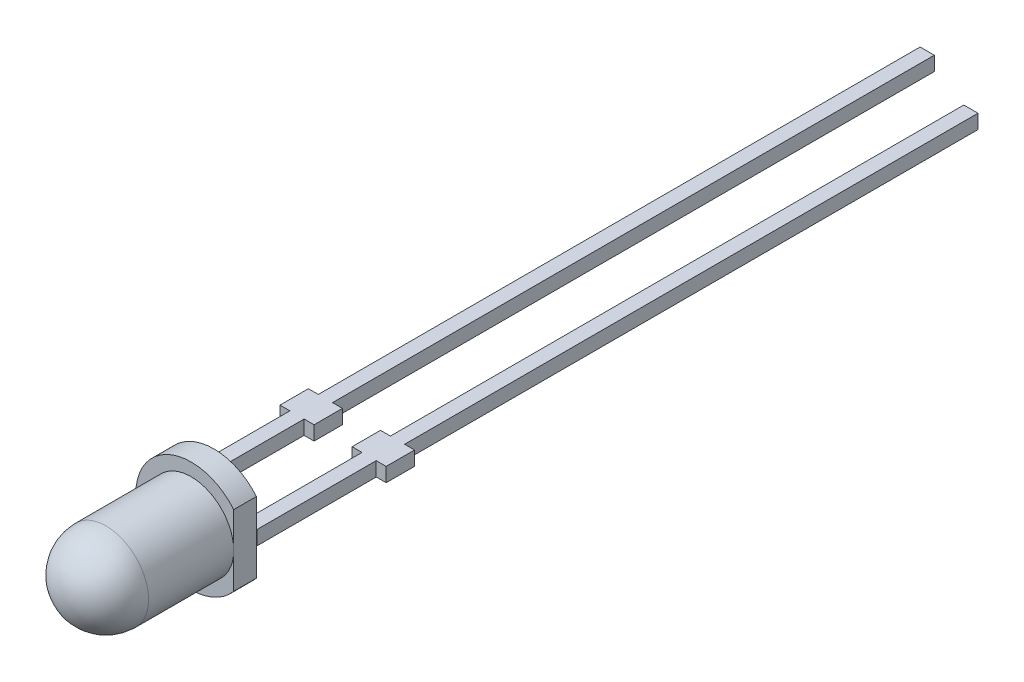
ISO-10303-21;
HEADER;
FILE_DESCRIPTION(('STEP AP214'),'2;1');
FILE_NAME('part.step','',(''),(''),'','','');
FILE_SCHEMA(('AUTOMOTIVE_DESIGN { 1 0 10303 214 1 1 1 1 }'));
ENDSEC;
DATA;
#1=APPLICATION_CONTEXT('core data for automotive mechanical design processes');
#2=APPLICATION_PROTOCOL_DEFINITION('international standard','automotive_design',2000,#1);
#3=PRODUCT_CONTEXT('',#1,'mechanical');
#4=PRODUCT('Part','Part','',(#3));
#5=PRODUCT_RELATED_PRODUCT_CATEGORY('part','',(#4));
#6=PRODUCT_DEFINITION_FORMATION('','',#4);
#7=PRODUCT_DEFINITION_CONTEXT('part definition',#1,'design');
#8=PRODUCT_DEFINITION('design','',#6,#7);
#9=PRODUCT_DEFINITION_SHAPE('','',#8);
#10=(LENGTH_UNIT() NAMED_UNIT(*) SI_UNIT(.MILLI.,.METRE.));
#11=(NAMED_UNIT(*) PLANE_ANGLE_UNIT() SI_UNIT($,.RADIAN.));
#12=(NAMED_UNIT(*) SI_UNIT($,.STERADIAN.) SOLID_ANGLE_UNIT());
#13=UNCERTAINTY_MEASURE_WITH_UNIT(LENGTH_MEASURE(1.E-05),#10,'distance_accuracy_value','');
#14=(GEOMETRIC_REPRESENTATION_CONTEXT(3) GLOBAL_UNCERTAINTY_ASSIGNED_CONTEXT((#13)) GLOBAL_UNIT_ASSIGNED_CONTEXT((#10,
#11,#12)) REPRESENTATION_CONTEXT('',''));
#15=CARTESIAN_POINT('',(0.,0.,0.));
#16=DIRECTION('',(0.,0.,1.));
#17=DIRECTION('',(1.,0.,0.));
#18=AXIS2_PLACEMENT_3D('',#15,#16,#17);
#19=CARTESIAN_POINT('',(-1.52,0.25,-26.4));
#20=DIRECTION('',(-1.,0.,0.));
#21=DIRECTION('',(0.,0.,1.));
#22=AXIS2_PLACEMENT_3D('',#19,#20,#21);
#23=PLANE('',#22);
#24=DIRECTION('',(0.,0.,1.));
#25=VECTOR('',#24,1.);
#26=CARTESIAN_POINT('',(-1.52,-0.25,-26.4));
#27=LINE('',#26,#25);
#28=CARTESIAN_POINT('',(-1.52,-0.25,-26.4));
#29=VERTEX_POINT('',#28);
#30=CARTESIAN_POINT('',(-1.52,-0.25,-5.2));
#31=VERTEX_POINT('',#30);
#32=EDGE_CURVE('E11',#29,#31,#27,.T.);
#33=ORIENTED_EDGE('',*,*,#32,.T.);
#34=DIRECTION('',(0.,1.,0.));
#35=VECTOR('',#34,1.);
#36=CARTESIAN_POINT('',(-1.52,0.25,-5.2));
#37=LINE('',#36,#35);
#38=CARTESIAN_POINT('',(-1.52,0.25,-5.2));
#39=VERTEX_POINT('',#38);
#40=EDGE_CURVE('E24',#31,#39,#37,.T.);
#41=ORIENTED_EDGE('',*,*,#40,.T.);
#42=DIRECTION('',(0.,0.,1.));
#43=VECTOR('',#42,1.);
#44=CARTESIAN_POINT('',(-1.52,0.25,-26.4));
#45=LINE('',#44,#43);
#46=CARTESIAN_POINT('',(-1.52,0.25,-26.4));
#47=VERTEX_POINT('',#46);
#48=EDGE_CURVE('E412',#47,#39,#45,.T.);
#49=ORIENTED_EDGE('',*,*,#48,.F.);
#50=DIRECTION('',(0.,-1.,0.));
#51=VECTOR('',#50,1.);
#52=CARTESIAN_POINT('',(-1.52,0.25,-26.4));
#53=LINE('',#52,#51);
#54=EDGE_CURVE('E410',#47,#29,#53,.T.);
#55=ORIENTED_EDGE('',*,*,#54,.T.);
#56=EDGE_LOOP('',(#33,#41,#49,#55));
#57=FACE_BOUND('',#56,.T.);
#58=ADVANCED_FACE('F17',(#57),#23,.T.);
#59=CARTESIAN_POINT('',(0.,0.,3.8));
#60=DIRECTION('',(0.,0.,1.));
#61=DIRECTION('',(1.,0.,0.));
#62=AXIS2_PLACEMENT_3D('',#59,#60,#61);
#63=SPHERICAL_SURFACE('',#62,1.5);
#64=CARTESIAN_POINT('',(0.,0.,3.8));
#65=DIRECTION('',(0.,0.,-1.));
#66=DIRECTION('',(-1.,0.,0.));
#67=AXIS2_PLACEMENT_3D('',#64,#65,#66);
#68=CIRCLE('',#67,1.5);
#69=CARTESIAN_POINT('',(1.5,0.,3.8));
#70=VERTEX_POINT('',#69);
#71=CARTESIAN_POINT('',(-1.5,0.,3.8));
#72=VERTEX_POINT('',#71);
#73=EDGE_CURVE('E405',#70,#72,#68,.T.);
#74=ORIENTED_EDGE('',*,*,#73,.F.);
#75=CARTESIAN_POINT('',(1.5,0.,3.8));
#76=CARTESIAN_POINT('',(1.5,0.,4.1926990816987));
#77=CARTESIAN_POINT('',(1.3766584709696,0.,4.5853647510577));
#78=CARTESIAN_POINT('',(1.1297852244603,0.,4.9297852244603));
#79=CARTESIAN_POINT('',(0.78536475105771,0.,5.1766584709696));
#80=CARTESIAN_POINT('',(0.392699081698726,0.,5.3));
#81=CARTESIAN_POINT('',(0.,0.,5.3));
#82=B_SPLINE_CURVE_WITH_KNOTS('',6,(#75,#76,#77,#78,#79,#80,#81),.UNSPECIFIED.,.F.,.F.,(7,7),
(0.,1.5707963267949),.UNSPECIFIED.);
#83=CARTESIAN_POINT('',(0.,0.,5.3));
#84=VERTEX_POINT('',#83);
#85=EDGE_CURVE('E401',#70,#84,#82,.T.);
#86=ORIENTED_EDGE('',*,*,#85,.T.);
#87=ORIENTED_EDGE('',*,*,#85,.F.);
#88=EDGE_CURVE('E400',#72,#70,#68,.T.);
#89=ORIENTED_EDGE('',*,*,#88,.F.);
#90=EDGE_LOOP('',(#74,#86,#87,#89));
#91=FACE_BOUND('',#90,.T.);
#92=ADVANCED_FACE('F565',(#91),#63,.T.);
#93=CARTESIAN_POINT('',(-1.87,-0.25,-5.2));
#94=DIRECTION('',(0.,0.,1.));
#95=DIRECTION('',(1.,0.,0.));
#96=AXIS2_PLACEMENT_3D('',#93,#94,#95);
#97=PLANE('',#96);
#98=ORIENTED_EDGE('',*,*,#40,.F.);
#99=DIRECTION('',(1.,0.,0.));
#100=VECTOR('',#99,1.);
#101=CARTESIAN_POINT('',(-1.87,-0.25,-5.2));
#102=LINE('',#101,#100);
#103=CARTESIAN_POINT('',(-1.87,-0.25,-5.2));
#104=VERTEX_POINT('',#103);
#105=EDGE_CURVE('E398',#104,#31,#102,.T.);
#106=ORIENTED_EDGE('',*,*,#105,.F.);
#107=DIRECTION('',(0.,1.,0.));
#108=VECTOR('',#107,1.);
#109=CARTESIAN_POINT('',(-1.87,-0.25,-5.2));
#110=LINE('',#109,#108);
#111=CARTESIAN_POINT('',(-1.87,0.25,-5.2));
#112=VERTEX_POINT('',#111);
#113=EDGE_CURVE('E396',#104,#112,#110,.T.);
#114=ORIENTED_EDGE('',*,*,#113,.T.);
#115=DIRECTION('',(1.,0.,0.));
#116=VECTOR('',#115,1.);
#117=CARTESIAN_POINT('',(-1.87,0.25,-5.2));
#118=LINE('',#117,#116);
#119=EDGE_CURVE('E393',#112,#39,#118,.T.);
#120=ORIENTED_EDGE('',*,*,#119,.T.);
#121=EDGE_LOOP('',(#98,#106,#114,#120));
#122=FACE_BOUND('',#121,.T.);
#123=ADVANCED_FACE('F421',(#122),#97,.F.);
#124=CARTESIAN_POINT('',(-1.52,-0.25,-26.4));
#125=DIRECTION('',(0.,-1.,0.));
#126=DIRECTION('',(0.,0.,-1.));
#127=AXIS2_PLACEMENT_3D('',#124,#125,#126);
#128=PLANE('',#127);
#129=DIRECTION('',(0.,0.,1.));
#130=VECTOR('',#129,1.);
#131=CARTESIAN_POINT('',(-1.52,-0.25,-26.4));
#132=LINE('',#131,#130);
#133=CARTESIAN_POINT('',(-1.52,-0.25,-4.2));
#134=VERTEX_POINT('',#133);
#135=CARTESIAN_POINT('',(-1.52,-0.25,0.));
#136=VERTEX_POINT('',#135);
#137=EDGE_CURVE('E391',#134,#136,#132,.T.);
#138=ORIENTED_EDGE('',*,*,#137,.F.);
#139=DIRECTION('',(-1.,0.,0.));
#140=VECTOR('',#139,1.);
#141=CARTESIAN_POINT('',(-0.67,-0.25,-4.2));
#142=LINE('',#141,#140);
#143=CARTESIAN_POINT('',(-1.87,-0.25,-4.2));
#144=VERTEX_POINT('',#143);
#145=EDGE_CURVE('E389',#134,#144,#142,.T.);
#146=ORIENTED_EDGE('',*,*,#145,.T.);
#147=DIRECTION('',(0.,0.,-1.));
#148=VECTOR('',#147,1.);
#149=CARTESIAN_POINT('',(-1.87,-0.25,-4.2));
#150=LINE('',#149,#148);
#151=EDGE_CURVE('E386',#144,#104,#150,.T.);
#152=ORIENTED_EDGE('',*,*,#151,.T.);
#153=ORIENTED_EDGE('',*,*,#105,.T.);
#154=ORIENTED_EDGE('',*,*,#32,.F.);
#155=DIRECTION('',(1.,0.,0.));
#156=VECTOR('',#155,1.);
#157=CARTESIAN_POINT('',(-1.52,-0.25,-26.4));
#158=LINE('',#157,#156);
#159=CARTESIAN_POINT('',(-1.02,-0.25,-26.4));
#160=VERTEX_POINT('',#159);
#161=EDGE_CURVE('E384',#29,#160,#158,.T.);
#162=ORIENTED_EDGE('',*,*,#161,.T.);
#163=DIRECTION('',(0.,0.,1.));
#164=VECTOR('',#163,1.);
#165=CARTESIAN_POINT('',(-1.02,-0.25,-26.4));
#166=LINE('',#165,#164);
#167=CARTESIAN_POINT('',(-1.02,-0.25,-5.2));
#168=VERTEX_POINT('',#167);
#169=EDGE_CURVE('E382',#160,#168,#166,.T.);
#170=ORIENTED_EDGE('',*,*,#169,.T.);
#171=DIRECTION('',(1.,0.,0.));
#172=VECTOR('',#171,1.);
#173=CARTESIAN_POINT('',(-1.87,-0.25,-5.2));
#174=LINE('',#173,#172);
#175=CARTESIAN_POINT('',(-0.67,-0.25,-5.2));
#176=VERTEX_POINT('',#175);
#177=EDGE_CURVE('E380',#168,#176,#174,.T.);
#178=ORIENTED_EDGE('',*,*,#177,.T.);
#179=DIRECTION('',(0.,0.,1.));
#180=VECTOR('',#179,1.);
#181=CARTESIAN_POINT('',(-0.67,-0.25,-5.2));
#182=LINE('',#181,#180);
#183=CARTESIAN_POINT('',(-0.67,-0.25,-4.2));
#184=VERTEX_POINT('',#183);
#185=EDGE_CURVE('E378',#176,#184,#182,.T.);
#186=ORIENTED_EDGE('',*,*,#185,.T.);
#187=DIRECTION('',(-1.,0.,0.));
#188=VECTOR('',#187,1.);
#189=CARTESIAN_POINT('',(-0.67,-0.25,-4.2));
#190=LINE('',#189,#188);
#191=CARTESIAN_POINT('',(-1.02,-0.25,-4.2));
#192=VERTEX_POINT('',#191);
#193=EDGE_CURVE('E376',#184,#192,#190,.T.);
#194=ORIENTED_EDGE('',*,*,#193,.T.);
#195=DIRECTION('',(0.,0.,1.));
#196=VECTOR('',#195,1.);
#197=CARTESIAN_POINT('',(-1.02,-0.25,-26.4));
#198=LINE('',#197,#196);
#199=CARTESIAN_POINT('',(-1.02,-0.25,0.));
#200=VERTEX_POINT('',#199);
#201=EDGE_CURVE('E374',#192,#200,#198,.T.);
#202=ORIENTED_EDGE('',*,*,#201,.T.);
#203=DIRECTION('',(1.,0.,0.));
#204=VECTOR('',#203,1.);
#205=CARTESIAN_POINT('',(-1.52,-0.25,0.));
#206=LINE('',#205,#204);
#207=EDGE_CURVE('E371',#136,#200,#206,.T.);
#208=ORIENTED_EDGE('',*,*,#207,.F.);
#209=EDGE_LOOP('',(#138,#146,#152,#153,#154,#162,#170,#178,#186,#194,#202,#208));
#210=FACE_BOUND('',#209,.T.);
#211=ADVANCED_FACE('F427',(#210),#128,.T.);
#212=CARTESIAN_POINT('',(-1.87,-0.25,-4.2));
#213=DIRECTION('',(1.,0.,0.));
#214=DIRECTION('',(0.,0.,-1.));
#215=AXIS2_PLACEMENT_3D('',#212,#213,#214);
#216=PLANE('',#215);
#217=DIRECTION('',(0.,0.,-1.));
#218=VECTOR('',#217,1.);
#219=CARTESIAN_POINT('',(-1.87,0.25,-4.2));
#220=LINE('',#219,#218);
#221=CARTESIAN_POINT('',(-1.87,0.25,-4.2));
#222=VERTEX_POINT('',#221);
#223=EDGE_CURVE('E368',#222,#112,#220,.T.);
#224=ORIENTED_EDGE('',*,*,#223,.T.);
#225=ORIENTED_EDGE('',*,*,#113,.F.);
#226=ORIENTED_EDGE('',*,*,#151,.F.);
#227=DIRECTION('',(0.,1.,0.));
#228=VECTOR('',#227,1.);
#229=CARTESIAN_POINT('',(-1.87,-0.25,-4.2));
#230=LINE('',#229,#228);
#231=EDGE_CURVE('E365',#144,#222,#230,.T.);
#232=ORIENTED_EDGE('',*,*,#231,.T.);
#233=EDGE_LOOP('',(#224,#225,#226,#232));
#234=FACE_BOUND('',#233,.T.);
#235=ADVANCED_FACE('F425',(#234),#216,.F.);
#236=CARTESIAN_POINT('',(1.5,-1.95,5.5731499172371));
#237=DIRECTION('',(-1.,0.,0.));
#238=DIRECTION('',(0.,0.,1.));
#239=AXIS2_PLACEMENT_3D('',#236,#237,#238);
#240=PLANE('',#239);
#241=DIRECTION('',(0.,0.,-1.));
#242=VECTOR('',#241,1.);
#243=CARTESIAN_POINT('',(1.5,1.2459935794377,0.8));
#244=LINE('',#243,#242);
#245=CARTESIAN_POINT('',(1.5,1.2459935794377,0.8));
#246=VERTEX_POINT('',#245);
#247=CARTESIAN_POINT('',(1.5,1.2459935794377,0.));
#248=VERTEX_POINT('',#247);
#249=EDGE_CURVE('E363',#246,#248,#244,.T.);
#250=ORIENTED_EDGE('',*,*,#249,.F.);
#251=DIRECTION('',(0.,1.,0.));
#252=VECTOR('',#251,1.);
#253=CARTESIAN_POINT('',(1.5,0.,0.8));
#254=LINE('',#253,#252);
#255=CARTESIAN_POINT('',(1.5,0.,0.8));
#256=VERTEX_POINT('',#255);
#257=EDGE_CURVE('E360',#256,#246,#254,.T.);
#258=ORIENTED_EDGE('',*,*,#257,.F.);
#259=DIRECTION('',(0.,1.,0.));
#260=VECTOR('',#259,1.);
#261=CARTESIAN_POINT('',(1.5,0.,0.8));
#262=LINE('',#261,#260);
#263=CARTESIAN_POINT('',(1.5,-1.2459935794377,0.8));
#264=VERTEX_POINT('',#263);
#265=EDGE_CURVE('E357',#264,#256,#262,.T.);
#266=ORIENTED_EDGE('',*,*,#265,.F.);
#267=DIRECTION('',(0.,0.,-1.));
#268=VECTOR('',#267,1.);
#269=CARTESIAN_POINT('',(1.5,-1.2459935794377,0.8));
#270=LINE('',#269,#268);
#271=CARTESIAN_POINT('',(1.5,-1.2459935794377,0.));
#272=VERTEX_POINT('',#271);
#273=EDGE_CURVE('E355',#264,#272,#270,.T.);
#274=ORIENTED_EDGE('',*,*,#273,.T.);
#275=DIRECTION('',(0.,1.,0.));
#276=VECTOR('',#275,1.);
#277=CARTESIAN_POINT('',(1.5,0.,0.));
#278=LINE('',#277,#276);
#279=CARTESIAN_POINT('',(1.5,-0.25,0.));
#280=VERTEX_POINT('',#279);
#281=EDGE_CURVE('E353',#272,#280,#278,.T.);
#282=ORIENTED_EDGE('',*,*,#281,.T.);
#283=DIRECTION('',(0.,1.,0.));
#284=VECTOR('',#283,1.);
#285=CARTESIAN_POINT('',(1.5,0.,0.));
#286=LINE('',#285,#284);
#287=CARTESIAN_POINT('',(1.5,0.25,0.));
#288=VERTEX_POINT('',#287);
#289=EDGE_CURVE('E351',#280,#288,#286,.T.);
#290=ORIENTED_EDGE('',*,*,#289,.T.);
#291=DIRECTION('',(0.,1.,0.));
#292=VECTOR('',#291,1.);
#293=CARTESIAN_POINT('',(1.5,0.,0.));
#294=LINE('',#293,#292);
#295=EDGE_CURVE('E348',#288,#248,#294,.T.);
#296=ORIENTED_EDGE('',*,*,#295,.T.);
#297=EDGE_LOOP('',(#250,#258,#266,#274,#282,#290,#296));
#298=FACE_BOUND('',#297,.T.);
#299=ADVANCED_FACE('F554',(#298),#240,.F.);
#300=CARTESIAN_POINT('',(0.,0.,0.8));
#301=DIRECTION('',(0.,0.,1.));
#302=DIRECTION('',(-1.,0.,0.));
#303=AXIS2_PLACEMENT_3D('',#300,#301,#302);
#304=CYLINDRICAL_SURFACE('',#303,1.95);
#305=ORIENTED_EDGE('',*,*,#249,.T.);
#306=CARTESIAN_POINT('',(0.,0.,0.));
#307=DIRECTION('',(0.,0.,-1.));
#308=DIRECTION('',(1.,0.,0.));
#309=AXIS2_PLACEMENT_3D('',#306,#307,#308);
#310=CIRCLE('',#309,1.95);
#311=EDGE_CURVE('E345',#272,#248,#310,.T.);
#312=ORIENTED_EDGE('',*,*,#311,.F.);
#313=ORIENTED_EDGE('',*,*,#273,.F.);
#314=CARTESIAN_POINT('',(0.,0.,0.8));
#315=DIRECTION('',(0.,0.,-1.));
#316=DIRECTION('',(1.,0.,0.));
#317=AXIS2_PLACEMENT_3D('',#314,#315,#316);
#318=CIRCLE('',#317,1.95);
#319=EDGE_CURVE('E342',#264,#246,#318,.T.);
#320=ORIENTED_EDGE('',*,*,#319,.T.);
#321=EDGE_LOOP('',(#305,#312,#313,#320));
#322=FACE_BOUND('',#321,.T.);
#323=ADVANCED_FACE('F467',(#322),#304,.T.);
#324=CARTESIAN_POINT('',(0.,0.,0.));
#325=DIRECTION('',(0.,0.,-1.));
#326=DIRECTION('',(-1.,0.,0.));
#327=AXIS2_PLACEMENT_3D('',#324,#325,#326);
#328=PLANE('',#327);
#329=DIRECTION('',(0.,-1.,0.));
#330=VECTOR('',#329,1.);
#331=CARTESIAN_POINT('',(-1.52,0.25,0.));
#332=LINE('',#331,#330);
#333=CARTESIAN_POINT('',(-1.52,0.25,0.));
#334=VERTEX_POINT('',#333);
#335=EDGE_CURVE('E339',#334,#136,#332,.T.);
#336=ORIENTED_EDGE('',*,*,#335,.T.);
#337=ORIENTED_EDGE('',*,*,#207,.T.);
#338=DIRECTION('',(0.,1.,0.));
#339=VECTOR('',#338,1.);
#340=CARTESIAN_POINT('',(-1.02,-0.25,0.));
#341=LINE('',#340,#339);
#342=CARTESIAN_POINT('',(-1.02,0.25,0.));
#343=VERTEX_POINT('',#342);
#344=EDGE_CURVE('E337',#200,#343,#341,.T.);
#345=ORIENTED_EDGE('',*,*,#344,.T.);
#346=DIRECTION('',(-1.,0.,0.));
#347=VECTOR('',#346,1.);
#348=CARTESIAN_POINT('',(-1.02,0.25,0.));
#349=LINE('',#348,#347);
#350=EDGE_CURVE('E334',#343,#334,#349,.T.);
#351=ORIENTED_EDGE('',*,*,#350,.T.);
#352=EDGE_LOOP('',(#336,#337,#345,#351));
#353=FACE_BOUND('',#352,.T.);
#354=DIRECTION('',(1.,0.,0.));
#355=VECTOR('',#354,1.);
#356=CARTESIAN_POINT('',(1.02,0.25,0.));
#357=LINE('',#356,#355);
#358=CARTESIAN_POINT('',(1.02,0.25,0.));
#359=VERTEX_POINT('',#358);
#360=EDGE_CURVE('E331',#359,#288,#357,.T.);
#361=ORIENTED_EDGE('',*,*,#360,.F.);
#362=DIRECTION('',(0.,1.,0.));
#363=VECTOR('',#362,1.);
#364=CARTESIAN_POINT('',(1.02,-0.25,0.));
#365=LINE('',#364,#363);
#366=CARTESIAN_POINT('',(1.02,-0.25,0.));
#367=VERTEX_POINT('',#366);
#368=EDGE_CURVE('E328',#367,#359,#365,.T.);
#369=ORIENTED_EDGE('',*,*,#368,.F.);
#370=DIRECTION('',(-1.,0.,0.));
#371=VECTOR('',#370,1.);
#372=CARTESIAN_POINT('',(1.52,-0.25,0.));
#373=LINE('',#372,#371);
#374=EDGE_CURVE('E325',#280,#367,#373,.T.);
#375=ORIENTED_EDGE('',*,*,#374,.F.);
#376=ORIENTED_EDGE('',*,*,#281,.F.);
#377=ORIENTED_EDGE('',*,*,#311,.T.);
#378=ORIENTED_EDGE('',*,*,#295,.F.);
#379=EDGE_LOOP('',(#361,#369,#375,#376,#377,#378));
#380=FACE_BOUND('',#379,.T.);
#381=ADVANCED_FACE('F463',(#353,#380),#328,.T.);
#382=CARTESIAN_POINT('',(1.52,-0.25,-26.4));
#383=DIRECTION('',(0.,1.,0.));
#384=DIRECTION('',(0.,0.,1.));
#385=AXIS2_PLACEMENT_3D('',#382,#383,#384);
#386=PLANE('',#385);
#387=DIRECTION('',(0.,0.,1.));
#388=VECTOR('',#387,1.);
#389=CARTESIAN_POINT('',(1.02,-0.25,-26.4));
#390=LINE('',#389,#388);
#391=CARTESIAN_POINT('',(1.02,-0.25,-4.2));
#392=VERTEX_POINT('',#391);
#393=EDGE_CURVE('E322',#392,#367,#390,.T.);
#394=ORIENTED_EDGE('',*,*,#393,.F.);
#395=DIRECTION('',(1.,0.,0.));
#396=VECTOR('',#395,1.);
#397=CARTESIAN_POINT('',(0.67,-0.25,-4.2));
#398=LINE('',#397,#396);
#399=CARTESIAN_POINT('',(0.67,-0.25,-4.2));
#400=VERTEX_POINT('',#399);
#401=EDGE_CURVE('E319',#400,#392,#398,.T.);
#402=ORIENTED_EDGE('',*,*,#401,.F.);
#403=DIRECTION('',(0.,0.,1.));
#404=VECTOR('',#403,1.);
#405=CARTESIAN_POINT('',(0.67,-0.25,-5.2));
#406=LINE('',#405,#404);
#407=CARTESIAN_POINT('',(0.67,-0.25,-5.2));
#408=VERTEX_POINT('',#407);
#409=EDGE_CURVE('E316',#408,#400,#406,.T.);
#410=ORIENTED_EDGE('',*,*,#409,.F.);
#411=DIRECTION('',(-1.,0.,0.));
#412=VECTOR('',#411,1.);
#413=CARTESIAN_POINT('',(1.87,-0.25,-5.2));
#414=LINE('',#413,#412);
#415=CARTESIAN_POINT('',(1.02,-0.25,-5.2));
#416=VERTEX_POINT('',#415);
#417=EDGE_CURVE('E313',#416,#408,#414,.T.);
#418=ORIENTED_EDGE('',*,*,#417,.F.);
#419=DIRECTION('',(0.,0.,1.));
#420=VECTOR('',#419,1.);
#421=CARTESIAN_POINT('',(1.02,-0.25,-26.4));
#422=LINE('',#421,#420);
#423=CARTESIAN_POINT('',(1.02,-0.25,-25.4));
#424=VERTEX_POINT('',#423);
#425=EDGE_CURVE('E310',#424,#416,#422,.T.);
#426=ORIENTED_EDGE('',*,*,#425,.F.);
#427=DIRECTION('',(1.,0.,0.));
#428=VECTOR('',#427,1.);
#429=CARTESIAN_POINT('',(1.52,-0.25,-25.4));
#430=LINE('',#429,#428);
#431=CARTESIAN_POINT('',(1.52,-0.25,-25.4));
#432=VERTEX_POINT('',#431);
#433=EDGE_CURVE('E308',#424,#432,#430,.T.);
#434=ORIENTED_EDGE('',*,*,#433,.T.);
#435=DIRECTION('',(0.,0.,1.));
#436=VECTOR('',#435,1.);
#437=CARTESIAN_POINT('',(1.52,-0.25,-26.4));
#438=LINE('',#437,#436);
#439=CARTESIAN_POINT('',(1.52,-0.25,-5.2));
#440=VERTEX_POINT('',#439);
#441=EDGE_CURVE('E306',#432,#440,#438,.T.);
#442=ORIENTED_EDGE('',*,*,#441,.T.);
#443=DIRECTION('',(-1.,0.,0.));
#444=VECTOR('',#443,1.);
#445=CARTESIAN_POINT('',(1.87,-0.25,-5.2));
#446=LINE('',#445,#444);
#447=CARTESIAN_POINT('',(1.87,-0.25,-5.2));
#448=VERTEX_POINT('',#447);
#449=EDGE_CURVE('E303',#448,#440,#446,.T.);
#450=ORIENTED_EDGE('',*,*,#449,.F.);
#451=DIRECTION('',(0.,0.,-1.));
#452=VECTOR('',#451,1.);
#453=CARTESIAN_POINT('',(1.87,-0.25,-4.2));
#454=LINE('',#453,#452);
#455=CARTESIAN_POINT('',(1.87,-0.25,-4.2));
#456=VERTEX_POINT('',#455);
#457=EDGE_CURVE('E300',#456,#448,#454,.T.);
#458=ORIENTED_EDGE('',*,*,#457,.F.);
#459=DIRECTION('',(1.,0.,0.));
#460=VECTOR('',#459,1.);
#461=CARTESIAN_POINT('',(0.67,-0.25,-4.2));
#462=LINE('',#461,#460);
#463=CARTESIAN_POINT('',(1.52,-0.25,-4.2));
#464=VERTEX_POINT('',#463);
#465=EDGE_CURVE('E297',#464,#456,#462,.T.);
#466=ORIENTED_EDGE('',*,*,#465,.F.);
#467=DIRECTION('',(0.,0.,1.));
#468=VECTOR('',#467,1.);
#469=CARTESIAN_POINT('',(1.52,-0.25,-26.4));
#470=LINE('',#469,#468);
#471=CARTESIAN_POINT('',(1.52,-0.25,0.));
#472=VERTEX_POINT('',#471);
#473=EDGE_CURVE('E295',#464,#472,#470,.T.);
#474=ORIENTED_EDGE('',*,*,#473,.T.);
#475=DIRECTION('',(-1.,0.,0.));
#476=VECTOR('',#475,1.);
#477=CARTESIAN_POINT('',(1.52,-0.25,0.));
#478=LINE('',#477,#476);
#479=EDGE_CURVE('E292',#472,#280,#478,.T.);
#480=ORIENTED_EDGE('',*,*,#479,.T.);
#481=ORIENTED_EDGE('',*,*,#374,.T.);
#482=EDGE_LOOP('',(#394,#402,#410,#418,#426,#434,#442,#450,#458,#466,#474,#480,#481));
#483=FACE_BOUND('',#482,.T.);
#484=ADVANCED_FACE('F466',(#483),#386,.F.);
#485=CARTESIAN_POINT('',(1.52,-0.25,0.));
#486=DIRECTION('',(0.,0.,-1.));
#487=DIRECTION('',(-1.,0.,0.));
#488=AXIS2_PLACEMENT_3D('',#485,#486,#487);
#489=PLANE('',#488);
#490=ORIENTED_EDGE('',*,*,#289,.F.);
#491=ORIENTED_EDGE('',*,*,#479,.F.);
#492=DIRECTION('',(0.,-1.,0.));
#493=VECTOR('',#492,1.);
#494=CARTESIAN_POINT('',(1.52,0.25,0.));
#495=LINE('',#494,#493);
#496=CARTESIAN_POINT('',(1.52,0.25,0.));
#497=VERTEX_POINT('',#496);
#498=EDGE_CURVE('E289',#497,#472,#495,.T.);
#499=ORIENTED_EDGE('',*,*,#498,.F.);
#500=DIRECTION('',(1.,0.,0.));
#501=VECTOR('',#500,1.);
#502=CARTESIAN_POINT('',(1.02,0.25,0.));
#503=LINE('',#502,#501);
#504=EDGE_CURVE('E286',#288,#497,#503,.T.);
#505=ORIENTED_EDGE('',*,*,#504,.F.);
#506=EDGE_LOOP('',(#490,#491,#499,#505));
#507=FACE_BOUND('',#506,.T.);
#508=ADVANCED_FACE('F546',(#507),#489,.F.);
#509=CARTESIAN_POINT('',(1.52,0.25,-26.4));
#510=DIRECTION('',(-1.,0.,0.));
#511=DIRECTION('',(0.,0.,1.));
#512=AXIS2_PLACEMENT_3D('',#509,#510,#511);
#513=PLANE('',#512);
#514=ORIENTED_EDGE('',*,*,#473,.F.);
#515=DIRECTION('',(0.,1.,0.));
#516=VECTOR('',#515,1.);
#517=CARTESIAN_POINT('',(1.52,0.25,-4.2));
#518=LINE('',#517,#516);
#519=CARTESIAN_POINT('',(1.52,0.25,-4.2));
#520=VERTEX_POINT('',#519);
#521=EDGE_CURVE('E284',#464,#520,#518,.T.);
#522=ORIENTED_EDGE('',*,*,#521,.T.);
#523=DIRECTION('',(0.,0.,1.));
#524=VECTOR('',#523,1.);
#525=CARTESIAN_POINT('',(1.52,0.25,-26.4));
#526=LINE('',#525,#524);
#527=EDGE_CURVE('E281',#520,#497,#526,.T.);
#528=ORIENTED_EDGE('',*,*,#527,.T.);
#529=ORIENTED_EDGE('',*,*,#498,.T.);
#530=EDGE_LOOP('',(#514,#522,#528,#529));
#531=FACE_BOUND('',#530,.T.);
#532=ADVANCED_FACE('F543',(#531),#513,.F.);
#533=CARTESIAN_POINT('',(1.02,0.25,-26.4));
#534=DIRECTION('',(0.,-1.,0.));
#535=DIRECTION('',(0.,0.,-1.));
#536=AXIS2_PLACEMENT_3D('',#533,#534,#535);
#537=PLANE('',#536);
#538=ORIENTED_EDGE('',*,*,#527,.F.);
#539=DIRECTION('',(1.,0.,0.));
#540=VECTOR('',#539,1.);
#541=CARTESIAN_POINT('',(0.67,0.25,-4.2));
#542=LINE('',#541,#540);
#543=CARTESIAN_POINT('',(1.87,0.25,-4.2));
#544=VERTEX_POINT('',#543);
#545=EDGE_CURVE('E279',#520,#544,#542,.T.);
#546=ORIENTED_EDGE('',*,*,#545,.T.);
#547=DIRECTION('',(0.,0.,-1.));
#548=VECTOR('',#547,1.);
#549=CARTESIAN_POINT('',(1.87,0.25,-4.2));
#550=LINE('',#549,#548);
#551=CARTESIAN_POINT('',(1.87,0.25,-5.2));
#552=VERTEX_POINT('',#551);
#553=EDGE_CURVE('E277',#544,#552,#550,.T.);
#554=ORIENTED_EDGE('',*,*,#553,.T.);
#555=DIRECTION('',(-1.,0.,0.));
#556=VECTOR('',#555,1.);
#557=CARTESIAN_POINT('',(1.87,0.25,-5.2));
#558=LINE('',#557,#556);
#559=CARTESIAN_POINT('',(1.52,0.25,-5.2));
#560=VERTEX_POINT('',#559);
#561=EDGE_CURVE('E275',#552,#560,#558,.T.);
#562=ORIENTED_EDGE('',*,*,#561,.T.);
#563=DIRECTION('',(0.,0.,1.));
#564=VECTOR('',#563,1.);
#565=CARTESIAN_POINT('',(1.52,0.25,-26.4));
#566=LINE('',#565,#564);
#567=CARTESIAN_POINT('',(1.52,0.25,-25.4));
#568=VERTEX_POINT('',#567);
#569=EDGE_CURVE('E272',#568,#560,#566,.T.);
#570=ORIENTED_EDGE('',*,*,#569,.F.);
#571=DIRECTION('',(1.,0.,0.));
#572=VECTOR('',#571,1.);
#573=CARTESIAN_POINT('',(1.02,0.25,-25.4));
#574=LINE('',#573,#572);
#575=CARTESIAN_POINT('',(1.02,0.25,-25.4));
#576=VERTEX_POINT('',#575);
#577=EDGE_CURVE('E269',#576,#568,#574,.T.);
#578=ORIENTED_EDGE('',*,*,#577,.F.);
#579=DIRECTION('',(0.,0.,1.));
#580=VECTOR('',#579,1.);
#581=CARTESIAN_POINT('',(1.02,0.25,-26.4));
#582=LINE('',#581,#580);
#583=CARTESIAN_POINT('',(1.02,0.25,-5.2));
#584=VERTEX_POINT('',#583);
#585=EDGE_CURVE('E267',#576,#584,#582,.T.);
#586=ORIENTED_EDGE('',*,*,#585,.T.);
#587=DIRECTION('',(-1.,0.,0.));
#588=VECTOR('',#587,1.);
#589=CARTESIAN_POINT('',(1.87,0.25,-5.2));
#590=LINE('',#589,#588);
#591=CARTESIAN_POINT('',(0.67,0.25,-5.2));
#592=VERTEX_POINT('',#591);
#593=EDGE_CURVE('E265',#584,#592,#590,.T.);
#594=ORIENTED_EDGE('',*,*,#593,.T.);
#595=DIRECTION('',(0.,0.,1.));
#596=VECTOR('',#595,1.);
#597=CARTESIAN_POINT('',(0.67,0.25,-5.2));
#598=LINE('',#597,#596);
#599=CARTESIAN_POINT('',(0.67,0.25,-4.2));
#600=VERTEX_POINT('',#599);
#601=EDGE_CURVE('E263',#592,#600,#598,.T.);
#602=ORIENTED_EDGE('',*,*,#601,.T.);
#603=DIRECTION('',(1.,0.,0.));
#604=VECTOR('',#603,1.);
#605=CARTESIAN_POINT('',(0.67,0.25,-4.2));
#606=LINE('',#605,#604);
#607=CARTESIAN_POINT('',(1.02,0.25,-4.2));
#608=VERTEX_POINT('',#607);
#609=EDGE_CURVE('E261',#600,#608,#606,.T.);
#610=ORIENTED_EDGE('',*,*,#609,.T.);
#611=DIRECTION('',(0.,0.,1.));
#612=VECTOR('',#611,1.);
#613=CARTESIAN_POINT('',(1.02,0.25,-26.4));
#614=LINE('',#613,#612);
#615=EDGE_CURVE('E258',#608,#359,#614,.T.);
#616=ORIENTED_EDGE('',*,*,#615,.T.);
#617=ORIENTED_EDGE('',*,*,#360,.T.);
#618=ORIENTED_EDGE('',*,*,#504,.T.);
#619=EDGE_LOOP('',(#538,#546,#554,#562,#570,#578,#586,#594,#602,#610,#616,#617,#618));
#620=FACE_BOUND('',#619,.T.);
#621=ADVANCED_FACE('F479',(#620),#537,.F.);
#622=CARTESIAN_POINT('',(-0.67,-0.25,-4.2));
#623=DIRECTION('',(0.,0.,-1.));
#624=DIRECTION('',(-1.,0.,0.));
#625=AXIS2_PLACEMENT_3D('',#622,#623,#624);
#626=PLANE('',#625);
#627=DIRECTION('',(0.,1.,0.));
#628=VECTOR('',#627,1.);
#629=CARTESIAN_POINT('',(-1.02,-0.25,-4.2));
#630=LINE('',#629,#628);
#631=CARTESIAN_POINT('',(-1.02,0.25,-4.2));
#632=VERTEX_POINT('',#631);
#633=EDGE_CURVE('E256',#192,#632,#630,.T.);
#634=ORIENTED_EDGE('',*,*,#633,.F.);
#635=ORIENTED_EDGE('',*,*,#193,.F.);
#636=DIRECTION('',(0.,1.,0.));
#637=VECTOR('',#636,1.);
#638=CARTESIAN_POINT('',(-0.67,-0.25,-4.2));
#639=LINE('',#638,#637);
#640=CARTESIAN_POINT('',(-0.67,0.25,-4.2));
#641=VERTEX_POINT('',#640);
#642=EDGE_CURVE('E254',#184,#641,#639,.T.);
#643=ORIENTED_EDGE('',*,*,#642,.T.);
#644=DIRECTION('',(-1.,0.,0.));
#645=VECTOR('',#644,1.);
#646=CARTESIAN_POINT('',(-0.67,0.25,-4.2));
#647=LINE('',#646,#645);
#648=EDGE_CURVE('E251',#641,#632,#647,.T.);
#649=ORIENTED_EDGE('',*,*,#648,.T.);
#650=EDGE_LOOP('',(#634,#635,#643,#649));
#651=FACE_BOUND('',#650,.T.);
#652=ADVANCED_FACE('F446',(#651),#626,.F.);
#653=CARTESIAN_POINT('',(-1.02,0.25,-26.4));
#654=DIRECTION('',(0.,1.,0.));
#655=DIRECTION('',(0.,0.,1.));
#656=AXIS2_PLACEMENT_3D('',#653,#654,#655);
#657=PLANE('',#656);
#658=DIRECTION('',(0.,0.,1.));
#659=VECTOR('',#658,1.);
#660=CARTESIAN_POINT('',(-1.02,0.25,-26.4));
#661=LINE('',#660,#659);
#662=EDGE_CURVE('E248',#632,#343,#661,.T.);
#663=ORIENTED_EDGE('',*,*,#662,.F.);
#664=ORIENTED_EDGE('',*,*,#648,.F.);
#665=DIRECTION('',(0.,0.,1.));
#666=VECTOR('',#665,1.);
#667=CARTESIAN_POINT('',(-0.67,0.25,-5.2));
#668=LINE('',#667,#666);
#669=CARTESIAN_POINT('',(-0.67,0.25,-5.2));
#670=VERTEX_POINT('',#669);
#671=EDGE_CURVE('E245',#670,#641,#668,.T.);
#672=ORIENTED_EDGE('',*,*,#671,.F.);
#673=DIRECTION('',(1.,0.,0.));
#674=VECTOR('',#673,1.);
#675=CARTESIAN_POINT('',(-1.87,0.25,-5.2));
#676=LINE('',#675,#674);
#677=CARTESIAN_POINT('',(-1.02,0.25,-5.2));
#678=VERTEX_POINT('',#677);
#679=EDGE_CURVE('E242',#678,#670,#676,.T.);
#680=ORIENTED_EDGE('',*,*,#679,.F.);
#681=DIRECTION('',(0.,0.,1.));
#682=VECTOR('',#681,1.);
#683=CARTESIAN_POINT('',(-1.02,0.25,-26.4));
#684=LINE('',#683,#682);
#685=CARTESIAN_POINT('',(-1.02,0.25,-26.4));
#686=VERTEX_POINT('',#685);
#687=EDGE_CURVE('E239',#686,#678,#684,.T.);
#688=ORIENTED_EDGE('',*,*,#687,.F.);
#689=DIRECTION('',(-1.,0.,0.));
#690=VECTOR('',#689,1.);
#691=CARTESIAN_POINT('',(-1.02,0.25,-26.4));
#692=LINE('',#691,#690);
#693=EDGE_CURVE('E236',#686,#47,#692,.T.);
#694=ORIENTED_EDGE('',*,*,#693,.T.);
#695=ORIENTED_EDGE('',*,*,#48,.T.);
#696=ORIENTED_EDGE('',*,*,#119,.F.);
#697=ORIENTED_EDGE('',*,*,#223,.F.);
#698=DIRECTION('',(-1.,0.,0.));
#699=VECTOR('',#698,1.);
#700=CARTESIAN_POINT('',(-0.67,0.25,-4.2));
#701=LINE('',#700,#699);
#702=CARTESIAN_POINT('',(-1.52,0.25,-4.2));
#703=VERTEX_POINT('',#702);
#704=EDGE_CURVE('E233',#703,#222,#701,.T.);
#705=ORIENTED_EDGE('',*,*,#704,.F.);
#706=DIRECTION('',(0.,0.,1.));
#707=VECTOR('',#706,1.);
#708=CARTESIAN_POINT('',(-1.52,0.25,-26.4));
#709=LINE('',#708,#707);
#710=EDGE_CURVE('E230',#703,#334,#709,.T.);
#711=ORIENTED_EDGE('',*,*,#710,.T.);
#712=ORIENTED_EDGE('',*,*,#350,.F.);
#713=EDGE_LOOP('',(#663,#664,#672,#680,#688,#694,#695,#696,#697,#705,#711,#712));
#714=FACE_BOUND('',#713,.T.);
#715=ADVANCED_FACE('F419',(#714),#657,.T.);
#716=CARTESIAN_POINT('',(-1.02,-0.25,-26.4));
#717=DIRECTION('',(1.,0.,0.));
#718=DIRECTION('',(0.,0.,-1.));
#719=AXIS2_PLACEMENT_3D('',#716,#717,#718);
#720=PLANE('',#719);
#721=ORIENTED_EDGE('',*,*,#201,.F.);
#722=ORIENTED_EDGE('',*,*,#633,.T.);
#723=ORIENTED_EDGE('',*,*,#662,.T.);
#724=ORIENTED_EDGE('',*,*,#344,.F.);
#725=EDGE_LOOP('',(#721,#722,#723,#724));
#726=FACE_BOUND('',#725,.T.);
#727=ADVANCED_FACE('F442',(#726),#720,.T.);
#728=CARTESIAN_POINT('',(-0.67,-0.25,-5.2));
#729=DIRECTION('',(-1.,0.,0.));
#730=DIRECTION('',(0.,0.,1.));
#731=AXIS2_PLACEMENT_3D('',#728,#729,#730);
#732=PLANE('',#731);
#733=ORIENTED_EDGE('',*,*,#671,.T.);
#734=ORIENTED_EDGE('',*,*,#642,.F.);
#735=ORIENTED_EDGE('',*,*,#185,.F.);
#736=DIRECTION('',(0.,1.,0.));
#737=VECTOR('',#736,1.);
#738=CARTESIAN_POINT('',(-0.67,-0.25,-5.2));
#739=LINE('',#738,#737);
#740=EDGE_CURVE('E227',#176,#670,#739,.T.);
#741=ORIENTED_EDGE('',*,*,#740,.T.);
#742=EDGE_LOOP('',(#733,#734,#735,#741));
#743=FACE_BOUND('',#742,.T.);
#744=ADVANCED_FACE('F449',(#743),#732,.F.);
#745=CARTESIAN_POINT('',(-1.87,-0.25,-5.2));
#746=DIRECTION('',(0.,0.,1.));
#747=DIRECTION('',(1.,0.,0.));
#748=AXIS2_PLACEMENT_3D('',#745,#746,#747);
#749=PLANE('',#748);
#750=DIRECTION('',(0.,-1.,0.));
#751=VECTOR('',#750,1.);
#752=CARTESIAN_POINT('',(-1.02,-0.25,-5.2));
#753=LINE('',#752,#751);
#754=EDGE_CURVE('E224',#678,#168,#753,.T.);
#755=ORIENTED_EDGE('',*,*,#754,.F.);
#756=ORIENTED_EDGE('',*,*,#679,.T.);
#757=ORIENTED_EDGE('',*,*,#740,.F.);
#758=ORIENTED_EDGE('',*,*,#177,.F.);
#759=EDGE_LOOP('',(#755,#756,#757,#758));
#760=FACE_BOUND('',#759,.T.);
#761=ADVANCED_FACE('F455',(#760),#749,.F.);
#762=CARTESIAN_POINT('',(-1.02,-0.25,-26.4));
#763=DIRECTION('',(1.,0.,0.));
#764=DIRECTION('',(0.,0.,-1.));
#765=AXIS2_PLACEMENT_3D('',#762,#763,#764);
#766=PLANE('',#765);
#767=ORIENTED_EDGE('',*,*,#687,.T.);
#768=ORIENTED_EDGE('',*,*,#754,.T.);
#769=ORIENTED_EDGE('',*,*,#169,.F.);
#770=DIRECTION('',(0.,1.,0.));
#771=VECTOR('',#770,1.);
#772=CARTESIAN_POINT('',(-1.02,-0.25,-26.4));
#773=LINE('',#772,#771);
#774=EDGE_CURVE('E214',#160,#686,#773,.T.);
#775=ORIENTED_EDGE('',*,*,#774,.T.);
#776=EDGE_LOOP('',(#767,#768,#769,#775));
#777=FACE_BOUND('',#776,.T.);
#778=ADVANCED_FACE('F457',(#777),#766,.T.);
#779=CARTESIAN_POINT('',(-1.52,-0.25,-26.4));
#780=DIRECTION('',(0.,0.,1.));
#781=DIRECTION('',(1.,0.,0.));
#782=AXIS2_PLACEMENT_3D('',#779,#780,#781);
#783=PLANE('',#782);
#784=ORIENTED_EDGE('',*,*,#54,.F.);
#785=ORIENTED_EDGE('',*,*,#693,.F.);
#786=ORIENTED_EDGE('',*,*,#774,.F.);
#787=ORIENTED_EDGE('',*,*,#161,.F.);
#788=EDGE_LOOP('',(#784,#785,#786,#787));
#789=FACE_BOUND('',#788,.T.);
#790=ADVANCED_FACE('F462',(#789),#783,.F.);
#791=CARTESIAN_POINT('',(-0.67,-0.25,-4.2));
#792=DIRECTION('',(0.,0.,-1.));
#793=DIRECTION('',(-1.,0.,0.));
#794=AXIS2_PLACEMENT_3D('',#791,#792,#793);
#795=PLANE('',#794);
#796=DIRECTION('',(0.,-1.,0.));
#797=VECTOR('',#796,1.);
#798=CARTESIAN_POINT('',(-1.52,0.25,-4.2));
#799=LINE('',#798,#797);
#800=EDGE_CURVE('E210',#703,#134,#799,.T.);
#801=ORIENTED_EDGE('',*,*,#800,.F.);
#802=ORIENTED_EDGE('',*,*,#704,.T.);
#803=ORIENTED_EDGE('',*,*,#231,.F.);
#804=ORIENTED_EDGE('',*,*,#145,.F.);
#805=EDGE_LOOP('',(#801,#802,#803,#804));
#806=FACE_BOUND('',#805,.T.);
#807=ADVANCED_FACE('F432',(#806),#795,.F.);
#808=CARTESIAN_POINT('',(-1.52,0.25,-26.4));
#809=DIRECTION('',(-1.,0.,0.));
#810=DIRECTION('',(0.,0.,1.));
#811=AXIS2_PLACEMENT_3D('',#808,#809,#810);
#812=PLANE('',#811);
#813=ORIENTED_EDGE('',*,*,#710,.F.);
#814=ORIENTED_EDGE('',*,*,#800,.T.);
#815=ORIENTED_EDGE('',*,*,#137,.T.);
#816=ORIENTED_EDGE('',*,*,#335,.F.);
#817=EDGE_LOOP('',(#813,#814,#815,#816));
#818=FACE_BOUND('',#817,.T.);
#819=ADVANCED_FACE('F435',(#818),#812,.T.);
#820=CARTESIAN_POINT('',(0.,0.,0.8));
#821=DIRECTION('',(0.,0.,-1.));
#822=DIRECTION('',(-1.,0.,0.));
#823=AXIS2_PLACEMENT_3D('',#820,#821,#822);
#824=PLANE('',#823);
#825=ORIENTED_EDGE('',*,*,#319,.F.);
#826=ORIENTED_EDGE('',*,*,#265,.T.);
#827=ORIENTED_EDGE('',*,*,#257,.T.);
#828=EDGE_LOOP('',(#825,#826,#827));
#829=FACE_BOUND('',#828,.T.);
#830=CARTESIAN_POINT('',(0.,0.,0.8));
#831=DIRECTION('',(0.,0.,-1.));
#832=DIRECTION('',(0.,1.,0.));
#833=AXIS2_PLACEMENT_3D('',#830,#831,#832);
#834=CIRCLE('',#833,1.5);
#835=CARTESIAN_POINT('',(1.5,0.,0.8));
#836=VERTEX_POINT('',#835);
#837=EDGE_CURVE('E205',#836,#836,#834,.T.);
#838=ORIENTED_EDGE('',*,*,#837,.T.);
#839=EDGE_LOOP('',(#838));
#840=FACE_BOUND('',#839,.T.);
#841=ADVANCED_FACE('F206',(#829,#840),#824,.F.);
#842=CARTESIAN_POINT('',(0.,0.,5.3));
#843=DIRECTION('',(0.,0.,1.));
#844=DIRECTION('',(-1.,0.,0.));
#845=AXIS2_PLACEMENT_3D('',#842,#843,#844);
#846=CYLINDRICAL_SURFACE('',#845,1.5);
#847=ORIENTED_EDGE('',*,*,#88,.T.);
#848=CARTESIAN_POINT('',(1.5,0.,0.8));
#849=CARTESIAN_POINT('',(1.5,0.,3.8));
#850=B_SPLINE_CURVE_WITH_KNOTS('',1,(#848,#849),.UNSPECIFIED.,.F.,.F.,(2,2),(-4.5,-1.5),.UNSPECIFIED.);
#851=EDGE_CURVE('E211',#836,#70,#850,.T.);
#852=ORIENTED_EDGE('',*,*,#851,.F.);
#853=ORIENTED_EDGE('',*,*,#837,.F.);
#854=ORIENTED_EDGE('',*,*,#851,.T.);
#855=ORIENTED_EDGE('',*,*,#73,.T.);
#856=EDGE_LOOP('',(#847,#852,#853,#854,#855));
#857=FACE_BOUND('',#856,.T.);
#858=ADVANCED_FACE('F721',(#857),#846,.T.);
#859=CARTESIAN_POINT('',(1.02,-0.25,-26.4));
#860=DIRECTION('',(1.,0.,0.));
#861=DIRECTION('',(0.,0.,-1.));
#862=AXIS2_PLACEMENT_3D('',#859,#860,#861);
#863=PLANE('',#862);
#864=ORIENTED_EDGE('',*,*,#615,.F.);
#865=DIRECTION('',(0.,-1.,0.));
#866=VECTOR('',#865,1.);
#867=CARTESIAN_POINT('',(1.02,-0.25,-4.2));
#868=LINE('',#867,#866);
#869=EDGE_CURVE('E216',#608,#392,#868,.T.);
#870=ORIENTED_EDGE('',*,*,#869,.T.);
#871=ORIENTED_EDGE('',*,*,#393,.T.);
#872=ORIENTED_EDGE('',*,*,#368,.T.);
#873=EDGE_LOOP('',(#864,#870,#871,#872));
#874=FACE_BOUND('',#873,.T.);
#875=ADVANCED_FACE('F475',(#874),#863,.F.);
#876=CARTESIAN_POINT('',(1.02,-0.25,-26.4));
#877=DIRECTION('',(1.,0.,0.));
#878=DIRECTION('',(0.,0.,-1.));
#879=AXIS2_PLACEMENT_3D('',#876,#877,#878);
#880=PLANE('',#879);
#881=ORIENTED_EDGE('',*,*,#425,.T.);
#882=DIRECTION('',(0.,1.,0.));
#883=VECTOR('',#882,1.);
#884=CARTESIAN_POINT('',(1.02,-0.25,-5.2));
#885=LINE('',#884,#883);
#886=EDGE_CURVE('E509',#416,#584,#885,.T.);
#887=ORIENTED_EDGE('',*,*,#886,.T.);
#888=ORIENTED_EDGE('',*,*,#585,.F.);
#889=DIRECTION('',(0.,1.,0.));
#890=VECTOR('',#889,1.);
#891=CARTESIAN_POINT('',(1.02,-32.12694974628,-25.4));
#892=LINE('',#891,#890);
#893=EDGE_CURVE('E506',#424,#576,#892,.T.);
#894=ORIENTED_EDGE('',*,*,#893,.F.);
#895=EDGE_LOOP('',(#881,#887,#888,#894));
#896=FACE_BOUND('',#895,.T.);
#897=ADVANCED_FACE('F514',(#896),#880,.F.);
#898=CARTESIAN_POINT('',(1.52,0.25,-26.4));
#899=DIRECTION('',(-1.,0.,0.));
#900=DIRECTION('',(0.,0.,1.));
#901=AXIS2_PLACEMENT_3D('',#898,#899,#900);
#902=PLANE('',#901);
#903=ORIENTED_EDGE('',*,*,#569,.T.);
#904=DIRECTION('',(0.,-1.,0.));
#905=VECTOR('',#904,1.);
#906=CARTESIAN_POINT('',(1.52,0.25,-5.2));
#907=LINE('',#906,#905);
#908=EDGE_CURVE('E503',#560,#440,#907,.T.);
#909=ORIENTED_EDGE('',*,*,#908,.T.);
#910=ORIENTED_EDGE('',*,*,#441,.F.);
#911=DIRECTION('',(0.,1.,0.));
#912=VECTOR('',#911,1.);
#913=CARTESIAN_POINT('',(1.52,-32.12694974628,-25.4));
#914=LINE('',#913,#912);
#915=EDGE_CURVE('E494',#432,#568,#914,.T.);
#916=ORIENTED_EDGE('',*,*,#915,.T.);
#917=EDGE_LOOP('',(#903,#909,#910,#916));
#918=FACE_BOUND('',#917,.T.);
#919=ADVANCED_FACE('F525',(#918),#902,.F.);
#920=CARTESIAN_POINT('',(1.02,-32.12694974628,-25.4));
#921=DIRECTION('',(0.,0.,1.));
#922=DIRECTION('',(1.,0.,0.));
#923=AXIS2_PLACEMENT_3D('',#920,#921,#922);
#924=PLANE('',#923);
#925=ORIENTED_EDGE('',*,*,#893,.T.);
#926=ORIENTED_EDGE('',*,*,#577,.T.);
#927=ORIENTED_EDGE('',*,*,#915,.F.);
#928=ORIENTED_EDGE('',*,*,#433,.F.);
#929=EDGE_LOOP('',(#925,#926,#927,#928));
#930=FACE_BOUND('',#929,.T.);
#931=ADVANCED_FACE('F521',(#930),#924,.F.);
#932=CARTESIAN_POINT('',(0.67,-0.25,-5.2));
#933=DIRECTION('',(-1.,0.,0.));
#934=DIRECTION('',(0.,0.,1.));
#935=AXIS2_PLACEMENT_3D('',#932,#933,#934);
#936=PLANE('',#935);
#937=ORIENTED_EDGE('',*,*,#601,.F.);
#938=DIRECTION('',(0.,1.,0.));
#939=VECTOR('',#938,1.);
#940=CARTESIAN_POINT('',(0.67,-0.25,-5.2));
#941=LINE('',#940,#939);
#942=EDGE_CURVE('E491',#408,#592,#941,.T.);
#943=ORIENTED_EDGE('',*,*,#942,.F.);
#944=ORIENTED_EDGE('',*,*,#409,.T.);
#945=DIRECTION('',(0.,1.,0.));
#946=VECTOR('',#945,1.);
#947=CARTESIAN_POINT('',(0.67,-0.25,-4.2));
#948=LINE('',#947,#946);
#949=EDGE_CURVE('E486',#400,#600,#948,.T.);
#950=ORIENTED_EDGE('',*,*,#949,.T.);
#951=EDGE_LOOP('',(#937,#943,#944,#950));
#952=FACE_BOUND('',#951,.T.);
#953=ADVANCED_FACE('F488',(#952),#936,.T.);
#954=CARTESIAN_POINT('',(1.87,-0.25,-4.2));
#955=DIRECTION('',(1.,0.,0.));
#956=DIRECTION('',(0.,0.,-1.));
#957=AXIS2_PLACEMENT_3D('',#954,#955,#956);
#958=PLANE('',#957);
#959=ORIENTED_EDGE('',*,*,#553,.F.);
#960=DIRECTION('',(0.,1.,0.));
#961=VECTOR('',#960,1.);
#962=CARTESIAN_POINT('',(1.87,-0.25,-4.2));
#963=LINE('',#962,#961);
#964=EDGE_CURVE('E492',#456,#544,#963,.T.);
#965=ORIENTED_EDGE('',*,*,#964,.F.);
#966=ORIENTED_EDGE('',*,*,#457,.T.);
#967=DIRECTION('',(0.,1.,0.));
#968=VECTOR('',#967,1.);
#969=CARTESIAN_POINT('',(1.87,-0.25,-5.2));
#970=LINE('',#969,#968);
#971=EDGE_CURVE('E497',#448,#552,#970,.T.);
#972=ORIENTED_EDGE('',*,*,#971,.T.);
#973=EDGE_LOOP('',(#959,#965,#966,#972));
#974=FACE_BOUND('',#973,.T.);
#975=ADVANCED_FACE('F535',(#974),#958,.T.);
#976=CARTESIAN_POINT('',(0.67,-0.25,-4.2));
#977=DIRECTION('',(0.,0.,1.));
#978=DIRECTION('',(1.,0.,0.));
#979=AXIS2_PLACEMENT_3D('',#976,#977,#978);
#980=PLANE('',#979);
#981=ORIENTED_EDGE('',*,*,#869,.F.);
#982=ORIENTED_EDGE('',*,*,#609,.F.);
#983=ORIENTED_EDGE('',*,*,#949,.F.);
#984=ORIENTED_EDGE('',*,*,#401,.T.);
#985=EDGE_LOOP('',(#981,#982,#983,#984));
#986=FACE_BOUND('',#985,.T.);
#987=ADVANCED_FACE('F485',(#986),#980,.T.);
#988=CARTESIAN_POINT('',(0.67,-0.25,-4.2));
#989=DIRECTION('',(0.,0.,1.));
#990=DIRECTION('',(1.,0.,0.));
#991=AXIS2_PLACEMENT_3D('',#988,#989,#990);
#992=PLANE('',#991);
#993=ORIENTED_EDGE('',*,*,#521,.F.);
#994=ORIENTED_EDGE('',*,*,#465,.T.);
#995=ORIENTED_EDGE('',*,*,#964,.T.);
#996=ORIENTED_EDGE('',*,*,#545,.F.);
#997=EDGE_LOOP('',(#993,#994,#995,#996));
#998=FACE_BOUND('',#997,.T.);
#999=ADVANCED_FACE('F540',(#998),#992,.T.);
#1000=CARTESIAN_POINT('',(1.87,-0.25,-5.2));
#1001=DIRECTION('',(0.,0.,-1.));
#1002=DIRECTION('',(-1.,0.,0.));
#1003=AXIS2_PLACEMENT_3D('',#1000,#1001,#1002);
#1004=PLANE('',#1003);
#1005=ORIENTED_EDGE('',*,*,#886,.F.);
#1006=ORIENTED_EDGE('',*,*,#417,.T.);
#1007=ORIENTED_EDGE('',*,*,#942,.T.);
#1008=ORIENTED_EDGE('',*,*,#593,.F.);
#1009=EDGE_LOOP('',(#1005,#1006,#1007,#1008));
#1010=FACE_BOUND('',#1009,.T.);
#1011=ADVANCED_FACE('F518',(#1010),#1004,.T.);
#1012=CARTESIAN_POINT('',(1.87,-0.25,-5.2));
#1013=DIRECTION('',(0.,0.,-1.));
#1014=DIRECTION('',(-1.,0.,0.));
#1015=AXIS2_PLACEMENT_3D('',#1012,#1013,#1014);
#1016=PLANE('',#1015);
#1017=ORIENTED_EDGE('',*,*,#908,.F.);
#1018=ORIENTED_EDGE('',*,*,#561,.F.);
#1019=ORIENTED_EDGE('',*,*,#971,.F.);
#1020=ORIENTED_EDGE('',*,*,#449,.T.);
#1021=EDGE_LOOP('',(#1017,#1018,#1019,#1020));
#1022=FACE_BOUND('',#1021,.T.);
#1023=ADVANCED_FACE('F530',(#1022),#1016,.T.);
#1024=CLOSED_SHELL('',(#58,#92,#123,#211,#235,#299,#323,#381,#484,#508,#532,#621,#652,#715,#727,
#744,#761,#778,#790,#807,#819,#841,#858,#875,#897,#919,#931,#953,#975,#987,#999,#1011,#1023));
#1025=MANIFOLD_SOLID_BREP('B1',#1024);
#1026=ADVANCED_BREP_SHAPE_REPRESENTATION('',(#18,#1025),#14);
#1027=SHAPE_DEFINITION_REPRESENTATION(#9,#1026);
ENDSEC;
END-ISO-10303-21;
